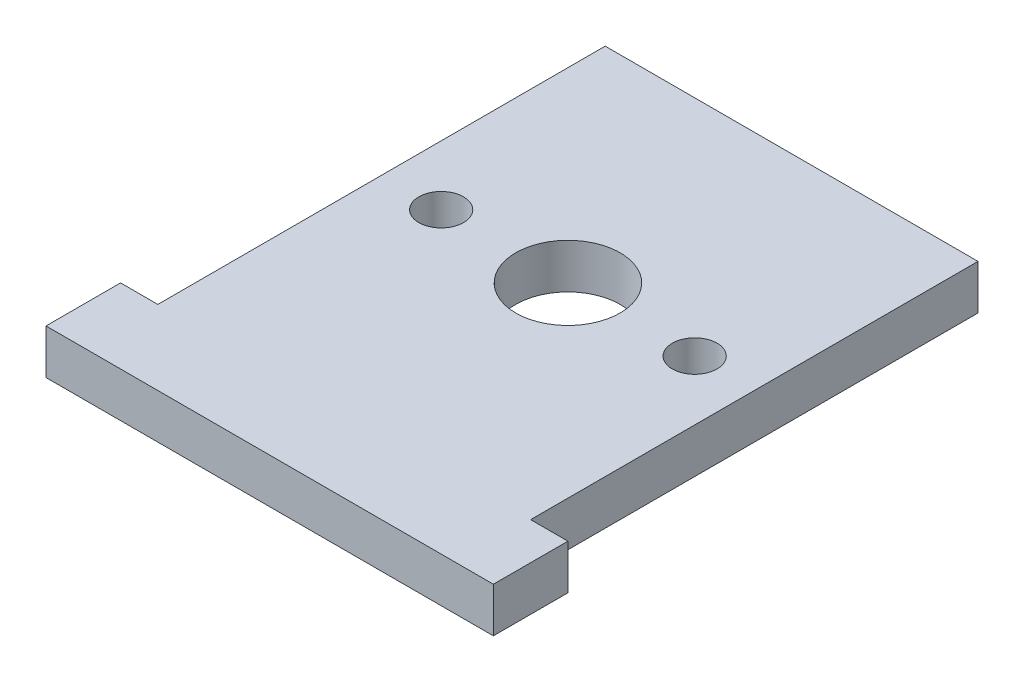
ISO-10303-21;
HEADER;
FILE_DESCRIPTION(('STEP AP214'),'2;1');
FILE_NAME('part.step','',(''),(''),'','','');
FILE_SCHEMA(('AUTOMOTIVE_DESIGN { 1 0 10303 214 1 1 1 1 }'));
ENDSEC;
DATA;
#1=APPLICATION_CONTEXT('core data for automotive mechanical design processes');
#2=APPLICATION_PROTOCOL_DEFINITION('international standard','automotive_design',2000,#1);
#3=PRODUCT_CONTEXT('',#1,'mechanical');
#4=PRODUCT('Part','Part','',(#3));
#5=PRODUCT_RELATED_PRODUCT_CATEGORY('part','',(#4));
#6=PRODUCT_DEFINITION_FORMATION('','',#4);
#7=PRODUCT_DEFINITION_CONTEXT('part definition',#1,'design');
#8=PRODUCT_DEFINITION('design','',#6,#7);
#9=PRODUCT_DEFINITION_SHAPE('','',#8);
#10=(LENGTH_UNIT() NAMED_UNIT(*) SI_UNIT(.MILLI.,.METRE.));
#11=(NAMED_UNIT(*) PLANE_ANGLE_UNIT() SI_UNIT($,.RADIAN.));
#12=(NAMED_UNIT(*) SI_UNIT($,.STERADIAN.) SOLID_ANGLE_UNIT());
#13=UNCERTAINTY_MEASURE_WITH_UNIT(LENGTH_MEASURE(1.E-05),#10,'distance_accuracy_value','');
#14=(GEOMETRIC_REPRESENTATION_CONTEXT(3) GLOBAL_UNCERTAINTY_ASSIGNED_CONTEXT((#13)) GLOBAL_UNIT_ASSIGNED_CONTEXT((#10,
#11,#12)) REPRESENTATION_CONTEXT('',''));
#15=CARTESIAN_POINT('',(0.,0.,0.));
#16=DIRECTION('',(0.,0.,1.));
#17=DIRECTION('',(1.,0.,0.));
#18=AXIS2_PLACEMENT_3D('',#15,#16,#17);
#19=CARTESIAN_POINT('',(-41.5230481673247,3.,21.7273715767845));
#20=DIRECTION('',(0.,0.,-1.));
#21=DIRECTION('',(-1.,0.,0.));
#22=AXIS2_PLACEMENT_3D('',#19,#20,#21);
#23=PLANE('',#22);
#24=DIRECTION('',(1.,0.,0.));
#25=VECTOR('',#24,1.);
#26=CARTESIAN_POINT('',(-41.5230481673247,0.,21.7273715767845));
#27=LINE('',#26,#25);
#28=CARTESIAN_POINT('',(-41.5230481673247,0.,21.7273715767845));
#29=VERTEX_POINT('',#28);
#30=CARTESIAN_POINT('',(-11.5230481673247,0.,21.7273715767845));
#31=VERTEX_POINT('',#30);
#32=EDGE_CURVE('E151',#29,#31,#27,.T.);
#33=ORIENTED_EDGE('',*,*,#32,.T.);
#34=DIRECTION('',(0.,-1.,0.));
#35=VECTOR('',#34,1.);
#36=CARTESIAN_POINT('',(-11.5230481673247,3.,21.7273715767845));
#37=LINE('',#36,#35);
#38=CARTESIAN_POINT('',(-11.5230481673247,3.,21.7273715767845));
#39=VERTEX_POINT('',#38);
#40=EDGE_CURVE('E150',#39,#31,#37,.T.);
#41=ORIENTED_EDGE('',*,*,#40,.F.);
#42=DIRECTION('',(1.,0.,0.));
#43=VECTOR('',#42,1.);
#44=CARTESIAN_POINT('',(-41.5230481673247,3.,21.7273715767845));
#45=LINE('',#44,#43);
#46=CARTESIAN_POINT('',(-41.5230481673247,3.,21.7273715767845));
#47=VERTEX_POINT('',#46);
#48=EDGE_CURVE('E169',#47,#39,#45,.T.);
#49=ORIENTED_EDGE('',*,*,#48,.F.);
#50=DIRECTION('',(0.,-1.,0.));
#51=VECTOR('',#50,1.);
#52=CARTESIAN_POINT('',(-41.5230481673247,3.,21.7273715767845));
#53=LINE('',#52,#51);
#54=EDGE_CURVE('E170',#47,#29,#53,.T.);
#55=ORIENTED_EDGE('',*,*,#54,.T.);
#56=EDGE_LOOP('',(#33,#41,#49,#55));
#57=FACE_BOUND('',#56,.T.);
#58=ADVANCED_FACE('F81',(#57),#23,.F.);
#59=CARTESIAN_POINT('',(-11.5230481673247,3.,16.7273715767845));
#60=DIRECTION('',(1.,0.,0.));
#61=DIRECTION('',(0.,0.,-1.));
#62=AXIS2_PLACEMENT_3D('',#59,#60,#61);
#63=PLANE('',#62);
#64=DIRECTION('',(0.,0.,1.));
#65=VECTOR('',#64,1.);
#66=CARTESIAN_POINT('',(-11.5230481673247,0.,16.7273715767845));
#67=LINE('',#66,#65);
#68=CARTESIAN_POINT('',(-11.5230481673247,0.,16.7273715767845));
#69=VERTEX_POINT('',#68);
#70=EDGE_CURVE('E153',#69,#31,#67,.T.);
#71=ORIENTED_EDGE('',*,*,#70,.F.);
#72=DIRECTION('',(0.,-1.,0.));
#73=VECTOR('',#72,1.);
#74=CARTESIAN_POINT('',(-11.5230481673247,3.,16.7273715767845));
#75=LINE('',#74,#73);
#76=CARTESIAN_POINT('',(-11.5230481673247,3.,16.7273715767845));
#77=VERTEX_POINT('',#76);
#78=EDGE_CURVE('E175',#77,#69,#75,.T.);
#79=ORIENTED_EDGE('',*,*,#78,.F.);
#80=DIRECTION('',(0.,0.,1.));
#81=VECTOR('',#80,1.);
#82=CARTESIAN_POINT('',(-11.5230481673247,3.,16.7273715767845));
#83=LINE('',#82,#81);
#84=EDGE_CURVE('E214',#77,#39,#83,.T.);
#85=ORIENTED_EDGE('',*,*,#84,.T.);
#86=ORIENTED_EDGE('',*,*,#40,.T.);
#87=EDGE_LOOP('',(#71,#79,#85,#86));
#88=FACE_BOUND('',#87,.T.);
#89=ADVANCED_FACE('F230',(#88),#63,.T.);
#90=CARTESIAN_POINT('',(-41.5230481673248,3.,16.7273715767845));
#91=DIRECTION('',(1.,0.,0.));
#92=DIRECTION('',(0.,0.,-1.));
#93=AXIS2_PLACEMENT_3D('',#90,#91,#92);
#94=PLANE('',#93);
#95=DIRECTION('',(0.,0.,1.));
#96=VECTOR('',#95,1.);
#97=CARTESIAN_POINT('',(-41.5230481673248,0.,16.7273715767845));
#98=LINE('',#97,#96);
#99=CARTESIAN_POINT('',(-41.5230481673248,0.,16.7273715767845));
#100=VERTEX_POINT('',#99);
#101=EDGE_CURVE('E166',#100,#29,#98,.T.);
#102=ORIENTED_EDGE('',*,*,#101,.T.);
#103=ORIENTED_EDGE('',*,*,#54,.F.);
#104=DIRECTION('',(0.,0.,1.));
#105=VECTOR('',#104,1.);
#106=CARTESIAN_POINT('',(-41.5230481673248,3.,16.7273715767845));
#107=LINE('',#106,#105);
#108=CARTESIAN_POINT('',(-41.5230481673248,3.,16.7273715767845));
#109=VERTEX_POINT('',#108);
#110=EDGE_CURVE('E162',#109,#47,#107,.T.);
#111=ORIENTED_EDGE('',*,*,#110,.F.);
#112=DIRECTION('',(0.,-1.,0.));
#113=VECTOR('',#112,1.);
#114=CARTESIAN_POINT('',(-41.5230481673248,3.,16.7273715767845));
#115=LINE('',#114,#113);
#116=EDGE_CURVE('E172',#109,#100,#115,.T.);
#117=ORIENTED_EDGE('',*,*,#116,.T.);
#118=EDGE_LOOP('',(#102,#103,#111,#117));
#119=FACE_BOUND('',#118,.T.);
#120=ADVANCED_FACE('F258',(#119),#94,.F.);
#121=CARTESIAN_POINT('',(0.,0.,0.));
#122=DIRECTION('',(0.,-1.,0.));
#123=DIRECTION('',(0.,0.,-1.));
#124=AXIS2_PLACEMENT_3D('',#121,#122,#123);
#125=PLANE('',#124);
#126=ORIENTED_EDGE('',*,*,#32,.F.);
#127=ORIENTED_EDGE('',*,*,#101,.F.);
#128=DIRECTION('',(1.,0.,0.));
#129=VECTOR('',#128,1.);
#130=CARTESIAN_POINT('',(-41.5230481673248,0.,16.7273715767845));
#131=LINE('',#130,#129);
#132=CARTESIAN_POINT('',(-39.0230481673247,0.,16.7273715767845));
#133=VERTEX_POINT('',#132);
#134=EDGE_CURVE('E139',#100,#133,#131,.T.);
#135=ORIENTED_EDGE('',*,*,#134,.T.);
#136=DIRECTION('',(0.,0.,1.));
#137=VECTOR('',#136,1.);
#138=CARTESIAN_POINT('',(-39.0230481673248,0.,-13.2726284232155));
#139=LINE('',#138,#137);
#140=CARTESIAN_POINT('',(-39.0230481673248,0.,-13.2726284232155));
#141=VERTEX_POINT('',#140);
#142=EDGE_CURVE('E124',#141,#133,#139,.T.);
#143=ORIENTED_EDGE('',*,*,#142,.F.);
#144=DIRECTION('',(1.,0.,0.));
#145=VECTOR('',#144,1.);
#146=CARTESIAN_POINT('',(-39.0230481673248,0.,-13.2726284232155));
#147=LINE('',#146,#145);
#148=CARTESIAN_POINT('',(-14.0230481673247,0.,-13.2726284232155));
#149=VERTEX_POINT('',#148);
#150=EDGE_CURVE('E136',#141,#149,#147,.T.);
#151=ORIENTED_EDGE('',*,*,#150,.T.);
#152=DIRECTION('',(0.,0.,1.));
#153=VECTOR('',#152,1.);
#154=CARTESIAN_POINT('',(-14.0230481673247,0.,-13.2726284232155));
#155=LINE('',#154,#153);
#156=CARTESIAN_POINT('',(-14.0230481673247,0.,16.7273715767845));
#157=VERTEX_POINT('',#156);
#158=EDGE_CURVE('E143',#149,#157,#155,.T.);
#159=ORIENTED_EDGE('',*,*,#158,.T.);
#160=EDGE_CURVE('E159',#157,#69,#131,.T.);
#161=ORIENTED_EDGE('',*,*,#160,.T.);
#162=ORIENTED_EDGE('',*,*,#70,.T.);
#163=EDGE_LOOP('',(#126,#127,#135,#143,#151,#159,#161,#162));
#164=FACE_BOUND('',#163,.T.);
#165=CARTESIAN_POINT('',(-35.0230481673248,0.,1.72737157678451));
#166=DIRECTION('',(0.,1.,0.));
#167=DIRECTION('',(0.,0.,1.));
#168=AXIS2_PLACEMENT_3D('',#165,#166,#167);
#169=CIRCLE('',#168,1.5);
#170=CARTESIAN_POINT('',(-35.0230481673248,0.,3.22737157678452));
#171=VERTEX_POINT('',#170);
#172=EDGE_CURVE('E183',#171,#171,#169,.T.);
#173=ORIENTED_EDGE('',*,*,#172,.T.);
#174=EDGE_LOOP('',(#173));
#175=FACE_BOUND('',#174,.T.);
#176=CARTESIAN_POINT('',(-26.5230481673247,0.,1.72737157678451));
#177=DIRECTION('',(0.,1.,0.));
#178=DIRECTION('',(0.,0.,1.));
#179=AXIS2_PLACEMENT_3D('',#176,#177,#178);
#180=CIRCLE('',#179,3.5);
#181=CARTESIAN_POINT('',(-26.5230481673247,0.,5.22737157678451));
#182=VERTEX_POINT('',#181);
#183=EDGE_CURVE('E190',#182,#182,#180,.T.);
#184=ORIENTED_EDGE('',*,*,#183,.T.);
#185=EDGE_LOOP('',(#184));
#186=FACE_BOUND('',#185,.T.);
#187=CARTESIAN_POINT('',(-18.0230481673247,0.,1.72737157678451));
#188=DIRECTION('',(0.,1.,0.));
#189=DIRECTION('',(0.,0.,1.));
#190=AXIS2_PLACEMENT_3D('',#187,#188,#189);
#191=CIRCLE('',#190,1.5);
#192=CARTESIAN_POINT('',(-18.0230481673247,0.,3.22737157678451));
#193=VERTEX_POINT('',#192);
#194=EDGE_CURVE('E184',#193,#193,#191,.T.);
#195=ORIENTED_EDGE('',*,*,#194,.T.);
#196=EDGE_LOOP('',(#195));
#197=FACE_BOUND('',#196,.T.);
#198=ADVANCED_FACE('F133',(#164,#175,#186,#197),#125,.T.);
#199=CARTESIAN_POINT('',(0.,3.,0.));
#200=DIRECTION('',(0.,-1.,0.));
#201=DIRECTION('',(0.,0.,-1.));
#202=AXIS2_PLACEMENT_3D('',#199,#200,#201);
#203=PLANE('',#202);
#204=ORIENTED_EDGE('',*,*,#48,.T.);
#205=ORIENTED_EDGE('',*,*,#84,.F.);
#206=DIRECTION('',(1.,0.,0.));
#207=VECTOR('',#206,1.);
#208=CARTESIAN_POINT('',(-41.5230481673248,3.,16.7273715767845));
#209=LINE('',#208,#207);
#210=CARTESIAN_POINT('',(-14.0230481673247,3.,16.7273715767845));
#211=VERTEX_POINT('',#210);
#212=EDGE_CURVE('E213',#211,#77,#209,.T.);
#213=ORIENTED_EDGE('',*,*,#212,.F.);
#214=DIRECTION('',(0.,0.,1.));
#215=VECTOR('',#214,1.);
#216=CARTESIAN_POINT('',(-14.0230481673247,3.,-13.2726284232155));
#217=LINE('',#216,#215);
#218=CARTESIAN_POINT('',(-14.0230481673247,3.,-13.2726284232155));
#219=VERTEX_POINT('',#218);
#220=EDGE_CURVE('E140',#219,#211,#217,.T.);
#221=ORIENTED_EDGE('',*,*,#220,.F.);
#222=DIRECTION('',(1.,0.,0.));
#223=VECTOR('',#222,1.);
#224=CARTESIAN_POINT('',(-39.0230481673248,3.,-13.2726284232155));
#225=LINE('',#224,#223);
#226=CARTESIAN_POINT('',(-39.0230481673248,3.,-13.2726284232155));
#227=VERTEX_POINT('',#226);
#228=EDGE_CURVE('E198',#227,#219,#225,.T.);
#229=ORIENTED_EDGE('',*,*,#228,.F.);
#230=DIRECTION('',(0.,0.,1.));
#231=VECTOR('',#230,1.);
#232=CARTESIAN_POINT('',(-39.0230481673248,3.,-13.2726284232155));
#233=LINE('',#232,#231);
#234=CARTESIAN_POINT('',(-39.0230481673247,3.,16.7273715767845));
#235=VERTEX_POINT('',#234);
#236=EDGE_CURVE('E127',#227,#235,#233,.T.);
#237=ORIENTED_EDGE('',*,*,#236,.T.);
#238=EDGE_CURVE('E207',#109,#235,#209,.T.);
#239=ORIENTED_EDGE('',*,*,#238,.F.);
#240=ORIENTED_EDGE('',*,*,#110,.T.);
#241=EDGE_LOOP('',(#204,#205,#213,#221,#229,#237,#239,#240));
#242=FACE_BOUND('',#241,.T.);
#243=CARTESIAN_POINT('',(-26.5230481673247,3.,1.72737157678451));
#244=DIRECTION('',(0.,1.,0.));
#245=DIRECTION('',(0.,0.,1.));
#246=AXIS2_PLACEMENT_3D('',#243,#244,#245);
#247=CIRCLE('',#246,3.5);
#248=CARTESIAN_POINT('',(-26.5230481673247,3.,5.22737157678451));
#249=VERTEX_POINT('',#248);
#250=EDGE_CURVE('E145',#249,#249,#247,.T.);
#251=ORIENTED_EDGE('',*,*,#250,.F.);
#252=EDGE_LOOP('',(#251));
#253=FACE_BOUND('',#252,.T.);
#254=CARTESIAN_POINT('',(-35.0230481673248,3.,1.72737157678451));
#255=DIRECTION('',(0.,1.,0.));
#256=DIRECTION('',(0.,0.,1.));
#257=AXIS2_PLACEMENT_3D('',#254,#255,#256);
#258=CIRCLE('',#257,1.5);
#259=CARTESIAN_POINT('',(-35.0230481673248,3.,3.22737157678452));
#260=VERTEX_POINT('',#259);
#261=EDGE_CURVE('E187',#260,#260,#258,.T.);
#262=ORIENTED_EDGE('',*,*,#261,.F.);
#263=EDGE_LOOP('',(#262));
#264=FACE_BOUND('',#263,.T.);
#265=CARTESIAN_POINT('',(-18.0230481673247,3.,1.72737157678451));
#266=DIRECTION('',(0.,1.,0.));
#267=DIRECTION('',(0.,0.,1.));
#268=AXIS2_PLACEMENT_3D('',#265,#266,#267);
#269=CIRCLE('',#268,1.5);
#270=CARTESIAN_POINT('',(-18.0230481673247,3.,3.22737157678451));
#271=VERTEX_POINT('',#270);
#272=EDGE_CURVE('E180',#271,#271,#269,.T.);
#273=ORIENTED_EDGE('',*,*,#272,.F.);
#274=EDGE_LOOP('',(#273));
#275=FACE_BOUND('',#274,.T.);
#276=ADVANCED_FACE('F203',(#242,#253,#264,#275),#203,.F.);
#277=CARTESIAN_POINT('',(-41.5230481673248,3.,16.7273715767845));
#278=DIRECTION('',(0.,0.,-1.));
#279=DIRECTION('',(-1.,0.,0.));
#280=AXIS2_PLACEMENT_3D('',#277,#278,#279);
#281=PLANE('',#280);
#282=ORIENTED_EDGE('',*,*,#238,.T.);
#283=DIRECTION('',(0.,-1.,0.));
#284=VECTOR('',#283,1.);
#285=CARTESIAN_POINT('',(-39.0230481673247,3.,16.7273715767845));
#286=LINE('',#285,#284);
#287=EDGE_CURVE('E90',#235,#133,#286,.T.);
#288=ORIENTED_EDGE('',*,*,#287,.T.);
#289=ORIENTED_EDGE('',*,*,#134,.F.);
#290=ORIENTED_EDGE('',*,*,#116,.F.);
#291=EDGE_LOOP('',(#282,#288,#289,#290));
#292=FACE_BOUND('',#291,.T.);
#293=ADVANCED_FACE('F211',(#292),#281,.T.);
#294=DIRECTION('',(0.,-1.,0.));
#295=VECTOR('',#294,1.);
#296=CARTESIAN_POINT('',(-14.0230481673247,3.,16.7273715767845));
#297=LINE('',#296,#295);
#298=EDGE_CURVE('E12',#211,#157,#297,.T.);
#299=ORIENTED_EDGE('',*,*,#298,.F.);
#300=ORIENTED_EDGE('',*,*,#212,.T.);
#301=ORIENTED_EDGE('',*,*,#78,.T.);
#302=ORIENTED_EDGE('',*,*,#160,.F.);
#303=EDGE_LOOP('',(#299,#300,#301,#302));
#304=FACE_BOUND('',#303,.T.);
#305=ADVANCED_FACE('F233',(#304),#281,.T.);
#306=CARTESIAN_POINT('',(-18.0230481673247,3.,1.72737157678451));
#307=DIRECTION('',(0.,-1.,0.));
#308=DIRECTION('',(0.,0.,-1.));
#309=AXIS2_PLACEMENT_3D('',#306,#307,#308);
#310=CYLINDRICAL_SURFACE('',#309,1.5);
#311=ORIENTED_EDGE('',*,*,#272,.T.);
#312=EDGE_LOOP('',(#311));
#313=FACE_BOUND('',#312,.T.);
#314=ORIENTED_EDGE('',*,*,#194,.F.);
#315=EDGE_LOOP('',(#314));
#316=FACE_BOUND('',#315,.T.);
#317=ADVANCED_FACE('F251',(#313,#316),#310,.F.);
#318=CARTESIAN_POINT('',(-35.0230481673248,3.,1.72737157678451));
#319=DIRECTION('',(0.,-1.,0.));
#320=DIRECTION('',(0.,0.,-1.));
#321=AXIS2_PLACEMENT_3D('',#318,#319,#320);
#322=CYLINDRICAL_SURFACE('',#321,1.5);
#323=ORIENTED_EDGE('',*,*,#261,.T.);
#324=EDGE_LOOP('',(#323));
#325=FACE_BOUND('',#324,.T.);
#326=ORIENTED_EDGE('',*,*,#172,.F.);
#327=EDGE_LOOP('',(#326));
#328=FACE_BOUND('',#327,.T.);
#329=ADVANCED_FACE('F263',(#325,#328),#322,.F.);
#330=CARTESIAN_POINT('',(-26.5230481673247,3.,1.72737157678451));
#331=DIRECTION('',(0.,-1.,0.));
#332=DIRECTION('',(0.,0.,-1.));
#333=AXIS2_PLACEMENT_3D('',#330,#331,#332);
#334=CYLINDRICAL_SURFACE('',#333,3.5);
#335=ORIENTED_EDGE('',*,*,#250,.T.);
#336=EDGE_LOOP('',(#335));
#337=FACE_BOUND('',#336,.T.);
#338=ORIENTED_EDGE('',*,*,#183,.F.);
#339=EDGE_LOOP('',(#338));
#340=FACE_BOUND('',#339,.T.);
#341=ADVANCED_FACE('F248',(#337,#340),#334,.F.);
#342=CARTESIAN_POINT('',(-39.0230481673248,3.,-13.2726284232155));
#343=DIRECTION('',(0.,0.,-1.));
#344=DIRECTION('',(-1.,0.,0.));
#345=AXIS2_PLACEMENT_3D('',#342,#343,#344);
#346=PLANE('',#345);
#347=ORIENTED_EDGE('',*,*,#150,.F.);
#348=DIRECTION('',(0.,-1.,0.));
#349=VECTOR('',#348,1.);
#350=CARTESIAN_POINT('',(-39.0230481673248,3.,-13.2726284232155));
#351=LINE('',#350,#349);
#352=EDGE_CURVE('E120',#227,#141,#351,.T.);
#353=ORIENTED_EDGE('',*,*,#352,.F.);
#354=ORIENTED_EDGE('',*,*,#228,.T.);
#355=DIRECTION('',(0.,-1.,0.));
#356=VECTOR('',#355,1.);
#357=CARTESIAN_POINT('',(-14.0230481673247,3.,-13.2726284232155));
#358=LINE('',#357,#356);
#359=EDGE_CURVE('E114',#219,#149,#358,.T.);
#360=ORIENTED_EDGE('',*,*,#359,.T.);
#361=EDGE_LOOP('',(#347,#353,#354,#360));
#362=FACE_BOUND('',#361,.T.);
#363=ADVANCED_FACE('F142',(#362),#346,.T.);
#364=CARTESIAN_POINT('',(-39.0230481673248,3.,-13.2726284232155));
#365=DIRECTION('',(1.,0.,0.));
#366=DIRECTION('',(0.,0.,-1.));
#367=AXIS2_PLACEMENT_3D('',#364,#365,#366);
#368=PLANE('',#367);
#369=ORIENTED_EDGE('',*,*,#142,.T.);
#370=ORIENTED_EDGE('',*,*,#287,.F.);
#371=ORIENTED_EDGE('',*,*,#236,.F.);
#372=ORIENTED_EDGE('',*,*,#352,.T.);
#373=EDGE_LOOP('',(#369,#370,#371,#372));
#374=FACE_BOUND('',#373,.T.);
#375=ADVANCED_FACE('F122',(#374),#368,.F.);
#376=CARTESIAN_POINT('',(-14.0230481673247,3.,-13.2726284232155));
#377=DIRECTION('',(1.,0.,0.));
#378=DIRECTION('',(0.,0.,-1.));
#379=AXIS2_PLACEMENT_3D('',#376,#377,#378);
#380=PLANE('',#379);
#381=ORIENTED_EDGE('',*,*,#158,.F.);
#382=ORIENTED_EDGE('',*,*,#359,.F.);
#383=ORIENTED_EDGE('',*,*,#220,.T.);
#384=ORIENTED_EDGE('',*,*,#298,.T.);
#385=EDGE_LOOP('',(#381,#382,#383,#384));
#386=FACE_BOUND('',#385,.T.);
#387=ADVANCED_FACE('F83',(#386),#380,.T.);
#388=CLOSED_SHELL('',(#58,#89,#120,#198,#276,#293,#305,#317,#329,#341,#363,#375,#387));
#389=MANIFOLD_SOLID_BREP('B2',#388);
#390=ADVANCED_BREP_SHAPE_REPRESENTATION('',(#18,#389),#14);
#391=SHAPE_DEFINITION_REPRESENTATION(#9,#390);
ENDSEC;
END-ISO-10303-21;
